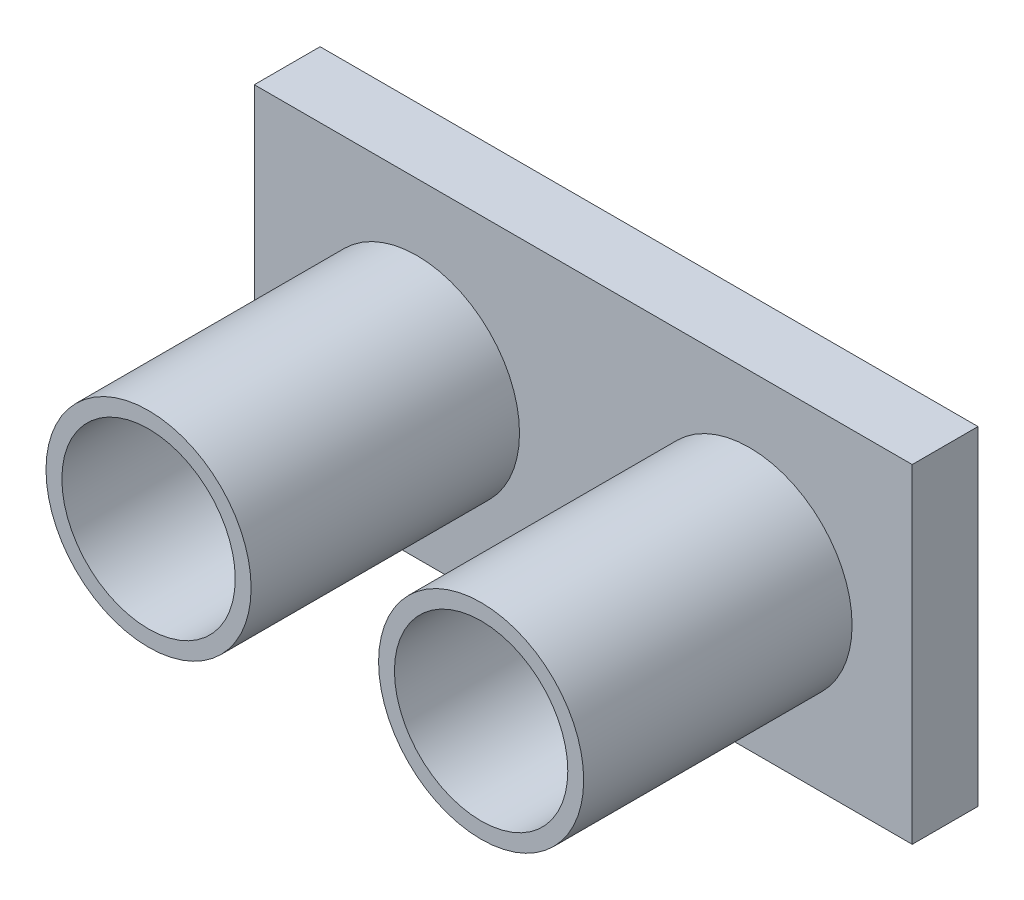
ISO-10303-21;
HEADER;
FILE_DESCRIPTION(('STEP AP214'),'2;1');
FILE_NAME('part.step','',(''),(''),'','','');
FILE_SCHEMA(('AUTOMOTIVE_DESIGN { 1 0 10303 214 1 1 1 1 }'));
ENDSEC;
DATA;
#1=APPLICATION_CONTEXT('core data for automotive mechanical design processes');
#2=APPLICATION_PROTOCOL_DEFINITION('international standard','automotive_design',2000,#1);
#3=PRODUCT_CONTEXT('',#1,'mechanical');
#4=PRODUCT('Part','Part','',(#3));
#5=PRODUCT_RELATED_PRODUCT_CATEGORY('part','',(#4));
#6=PRODUCT_DEFINITION_FORMATION('','',#4);
#7=PRODUCT_DEFINITION_CONTEXT('part definition',#1,'design');
#8=PRODUCT_DEFINITION('design','',#6,#7);
#9=PRODUCT_DEFINITION_SHAPE('','',#8);
#10=(LENGTH_UNIT() NAMED_UNIT(*) SI_UNIT(.MILLI.,.METRE.));
#11=(NAMED_UNIT(*) PLANE_ANGLE_UNIT() SI_UNIT($,.RADIAN.));
#12=(NAMED_UNIT(*) SI_UNIT($,.STERADIAN.) SOLID_ANGLE_UNIT());
#13=UNCERTAINTY_MEASURE_WITH_UNIT(LENGTH_MEASURE(1.E-05),#10,'distance_accuracy_value','');
#14=(GEOMETRIC_REPRESENTATION_CONTEXT(3) GLOBAL_UNCERTAINTY_ASSIGNED_CONTEXT((#13)) GLOBAL_UNIT_ASSIGNED_CONTEXT((#10,
#11,#12)) REPRESENTATION_CONTEXT('',''));
#15=CARTESIAN_POINT('',(0.,0.,0.));
#16=DIRECTION('',(0.,0.,1.));
#17=DIRECTION('',(1.,0.,0.));
#18=AXIS2_PLACEMENT_3D('',#15,#16,#17);
#19=CARTESIAN_POINT('',(0.,0.,10.));
#20=DIRECTION('',(-1.,0.,0.));
#21=DIRECTION('',(0.,0.,1.));
#22=AXIS2_PLACEMENT_3D('',#19,#20,#21);
#23=PLANE('',#22);
#24=DIRECTION('',(0.,1.,0.));
#25=VECTOR('',#24,1.);
#26=CARTESIAN_POINT('',(0.,0.,0.));
#27=LINE('',#26,#25);
#28=CARTESIAN_POINT('',(0.,0.,0.));
#29=VERTEX_POINT('',#28);
#30=CARTESIAN_POINT('',(0.,50.,0.));
#31=VERTEX_POINT('',#30);
#32=EDGE_CURVE('E115',#29,#31,#27,.T.);
#33=ORIENTED_EDGE('',*,*,#32,.T.);
#34=DIRECTION('',(0.,0.,-1.));
#35=VECTOR('',#34,1.);
#36=CARTESIAN_POINT('',(0.,50.,10.));
#37=LINE('',#36,#35);
#38=CARTESIAN_POINT('',(0.,50.,10.));
#39=VERTEX_POINT('',#38);
#40=EDGE_CURVE('E51',#39,#31,#37,.T.);
#41=ORIENTED_EDGE('',*,*,#40,.F.);
#42=DIRECTION('',(0.,1.,0.));
#43=VECTOR('',#42,1.);
#44=CARTESIAN_POINT('',(0.,0.,10.));
#45=LINE('',#44,#43);
#46=CARTESIAN_POINT('',(0.,0.,10.));
#47=VERTEX_POINT('',#46);
#48=EDGE_CURVE('E102',#47,#39,#45,.T.);
#49=ORIENTED_EDGE('',*,*,#48,.F.);
#50=DIRECTION('',(0.,0.,-1.));
#51=VECTOR('',#50,1.);
#52=CARTESIAN_POINT('',(0.,0.,10.));
#53=LINE('',#52,#51);
#54=EDGE_CURVE('E111',#47,#29,#53,.T.);
#55=ORIENTED_EDGE('',*,*,#54,.T.);
#56=EDGE_LOOP('',(#33,#41,#49,#55));
#57=FACE_BOUND('',#56,.T.);
#58=ADVANCED_FACE('F48',(#57),#23,.F.);
#59=CARTESIAN_POINT('',(0.,50.,10.));
#60=DIRECTION('',(0.,-1.,0.));
#61=DIRECTION('',(1.,0.,0.));
#62=AXIS2_PLACEMENT_3D('',#59,#60,#61);
#63=PLANE('',#62);
#64=DIRECTION('',(-1.,0.,0.));
#65=VECTOR('',#64,1.);
#66=CARTESIAN_POINT('',(0.,50.,0.));
#67=LINE('',#66,#65);
#68=CARTESIAN_POINT('',(-100.,50.,0.));
#69=VERTEX_POINT('',#68);
#70=EDGE_CURVE('E107',#31,#69,#67,.T.);
#71=ORIENTED_EDGE('',*,*,#70,.T.);
#72=DIRECTION('',(0.,0.,-1.));
#73=VECTOR('',#72,1.);
#74=CARTESIAN_POINT('',(-100.,50.,10.));
#75=LINE('',#74,#73);
#76=CARTESIAN_POINT('',(-100.,50.,10.));
#77=VERTEX_POINT('',#76);
#78=EDGE_CURVE('E105',#77,#69,#75,.T.);
#79=ORIENTED_EDGE('',*,*,#78,.F.);
#80=DIRECTION('',(-1.,0.,0.));
#81=VECTOR('',#80,1.);
#82=CARTESIAN_POINT('',(0.,50.,10.));
#83=LINE('',#82,#81);
#84=EDGE_CURVE('E97',#39,#77,#83,.T.);
#85=ORIENTED_EDGE('',*,*,#84,.F.);
#86=ORIENTED_EDGE('',*,*,#40,.T.);
#87=EDGE_LOOP('',(#71,#79,#85,#86));
#88=FACE_BOUND('',#87,.T.);
#89=ADVANCED_FACE('F106',(#88),#63,.F.);
#90=CARTESIAN_POINT('',(-100.,0.,10.));
#91=DIRECTION('',(1.,0.,0.));
#92=DIRECTION('',(0.,0.,-1.));
#93=AXIS2_PLACEMENT_3D('',#90,#91,#92);
#94=PLANE('',#93);
#95=DIRECTION('',(0.,-1.,0.));
#96=VECTOR('',#95,1.);
#97=CARTESIAN_POINT('',(-100.,0.,0.));
#98=LINE('',#97,#96);
#99=CARTESIAN_POINT('',(-100.,0.,0.));
#100=VERTEX_POINT('',#99);
#101=EDGE_CURVE('E83',#69,#100,#98,.T.);
#102=ORIENTED_EDGE('',*,*,#101,.T.);
#103=DIRECTION('',(0.,0.,-1.));
#104=VECTOR('',#103,1.);
#105=CARTESIAN_POINT('',(-100.,0.,10.));
#106=LINE('',#105,#104);
#107=CARTESIAN_POINT('',(-100.,0.,10.));
#108=VERTEX_POINT('',#107);
#109=EDGE_CURVE('E108',#108,#100,#106,.T.);
#110=ORIENTED_EDGE('',*,*,#109,.F.);
#111=DIRECTION('',(0.,-1.,0.));
#112=VECTOR('',#111,1.);
#113=CARTESIAN_POINT('',(-100.,0.,10.));
#114=LINE('',#113,#112);
#115=EDGE_CURVE('E100',#77,#108,#114,.T.);
#116=ORIENTED_EDGE('',*,*,#115,.F.);
#117=ORIENTED_EDGE('',*,*,#78,.T.);
#118=EDGE_LOOP('',(#102,#110,#116,#117));
#119=FACE_BOUND('',#118,.T.);
#120=ADVANCED_FACE('F109',(#119),#94,.F.);
#121=CARTESIAN_POINT('',(0.,0.,10.));
#122=DIRECTION('',(0.,1.,0.));
#123=DIRECTION('',(0.,0.,1.));
#124=AXIS2_PLACEMENT_3D('',#121,#122,#123);
#125=PLANE('',#124);
#126=DIRECTION('',(1.,0.,0.));
#127=VECTOR('',#126,1.);
#128=CARTESIAN_POINT('',(0.,0.,0.));
#129=LINE('',#128,#127);
#130=EDGE_CURVE('E89',#100,#29,#129,.T.);
#131=ORIENTED_EDGE('',*,*,#130,.T.);
#132=ORIENTED_EDGE('',*,*,#54,.F.);
#133=DIRECTION('',(1.,0.,0.));
#134=VECTOR('',#133,1.);
#135=CARTESIAN_POINT('',(0.,0.,10.));
#136=LINE('',#135,#134);
#137=EDGE_CURVE('E66',#108,#47,#136,.T.);
#138=ORIENTED_EDGE('',*,*,#137,.F.);
#139=ORIENTED_EDGE('',*,*,#109,.T.);
#140=EDGE_LOOP('',(#131,#132,#138,#139));
#141=FACE_BOUND('',#140,.T.);
#142=ADVANCED_FACE('F123',(#141),#125,.F.);
#143=CARTESIAN_POINT('',(0.,0.,10.));
#144=DIRECTION('',(0.,0.,1.));
#145=DIRECTION('',(1.,0.,0.));
#146=AXIS2_PLACEMENT_3D('',#143,#144,#145);
#147=PLANE('',#146);
#148=CARTESIAN_POINT('',(-24.7247612763741,24.2880370084113,10.));
#149=DIRECTION('',(0.,0.,1.));
#150=DIRECTION('',(1.,0.,0.));
#151=AXIS2_PLACEMENT_3D('',#148,#149,#150);
#152=CIRCLE('',#151,15.587917705514);
#153=CARTESIAN_POINT('',(-9.13684357086012,24.2880370084113,10.));
#154=VERTEX_POINT('',#153);
#155=EDGE_CURVE('E139',#154,#154,#152,.F.);
#156=ORIENTED_EDGE('',*,*,#155,.T.);
#157=EDGE_LOOP('',(#156));
#158=FACE_BOUND('',#157,.T.);
#159=CARTESIAN_POINT('',(-75.2752387236259,24.2880370084113,10.));
#160=DIRECTION('',(0.,0.,1.));
#161=DIRECTION('',(1.,0.,0.));
#162=AXIS2_PLACEMENT_3D('',#159,#160,#161);
#163=CIRCLE('',#162,15.587917705514);
#164=CARTESIAN_POINT('',(-59.6873210181119,24.2880370084113,10.));
#165=VERTEX_POINT('',#164);
#166=EDGE_CURVE('E118',#165,#165,#163,.F.);
#167=ORIENTED_EDGE('',*,*,#166,.T.);
#168=EDGE_LOOP('',(#167));
#169=FACE_BOUND('',#168,.T.);
#170=ORIENTED_EDGE('',*,*,#48,.T.);
#171=ORIENTED_EDGE('',*,*,#84,.T.);
#172=ORIENTED_EDGE('',*,*,#115,.T.);
#173=ORIENTED_EDGE('',*,*,#137,.T.);
#174=EDGE_LOOP('',(#170,#171,#172,#173));
#175=FACE_BOUND('',#174,.T.);
#176=ADVANCED_FACE('F98',(#158,#169,#175),#147,.T.);
#177=CARTESIAN_POINT('',(0.,0.,0.));
#178=DIRECTION('',(0.,0.,1.));
#179=DIRECTION('',(1.,0.,0.));
#180=AXIS2_PLACEMENT_3D('',#177,#178,#179);
#181=PLANE('',#180);
#182=ORIENTED_EDGE('',*,*,#32,.F.);
#183=ORIENTED_EDGE('',*,*,#130,.F.);
#184=ORIENTED_EDGE('',*,*,#101,.F.);
#185=ORIENTED_EDGE('',*,*,#70,.F.);
#186=EDGE_LOOP('',(#182,#183,#184,#185));
#187=FACE_BOUND('',#186,.T.);
#188=ADVANCED_FACE('F126',(#187),#181,.F.);
#189=CARTESIAN_POINT('',(-75.2752387236259,24.2880370084113,50.8));
#190=DIRECTION('',(0.,0.,1.));
#191=DIRECTION('',(1.,0.,0.));
#192=AXIS2_PLACEMENT_3D('',#189,#190,#191);
#193=PLANE('',#192);
#194=CARTESIAN_POINT('',(-75.2752387236259,24.2880370084113,50.8));
#195=DIRECTION('',(0.,0.,1.));
#196=DIRECTION('',(1.,0.,0.));
#197=AXIS2_PLACEMENT_3D('',#194,#195,#196);
#198=CIRCLE('',#197,15.587917705514);
#199=CARTESIAN_POINT('',(-59.6873210181119,24.2880370084113,50.8));
#200=VERTEX_POINT('',#199);
#201=EDGE_CURVE('E131',#200,#200,#198,.T.);
#202=ORIENTED_EDGE('',*,*,#201,.T.);
#203=EDGE_LOOP('',(#202));
#204=FACE_BOUND('',#203,.T.);
#205=CARTESIAN_POINT('',(-75.2752387236259,24.2880370084113,50.8));
#206=DIRECTION('',(0.,0.,1.));
#207=DIRECTION('',(1.,0.,0.));
#208=AXIS2_PLACEMENT_3D('',#205,#206,#207);
#209=CIRCLE('',#208,13.175239119621);
#210=CARTESIAN_POINT('',(-62.0999996040048,24.2880370084113,50.8));
#211=VERTEX_POINT('',#210);
#212=EDGE_CURVE('E136',#211,#211,#209,.T.);
#213=ORIENTED_EDGE('',*,*,#212,.F.);
#214=EDGE_LOOP('',(#213));
#215=FACE_BOUND('',#214,.T.);
#216=ADVANCED_FACE('F180',(#204,#215),#193,.T.);
#217=CARTESIAN_POINT('',(-75.2752387236259,24.2880370084113,50.8));
#218=DIRECTION('',(0.,0.,-1.));
#219=DIRECTION('',(-1.,0.,0.));
#220=AXIS2_PLACEMENT_3D('',#217,#218,#219);
#221=CYLINDRICAL_SURFACE('',#220,15.587917705514);
#222=ORIENTED_EDGE('',*,*,#166,.F.);
#223=EDGE_LOOP('',(#222));
#224=FACE_BOUND('',#223,.T.);
#225=ORIENTED_EDGE('',*,*,#201,.F.);
#226=EDGE_LOOP('',(#225));
#227=FACE_BOUND('',#226,.T.);
#228=ADVANCED_FACE('F184',(#224,#227),#221,.T.);
#229=CARTESIAN_POINT('',(-75.2752387236259,24.2880370084113,50.8));
#230=DIRECTION('',(0.,0.,-1.));
#231=DIRECTION('',(-1.,0.,0.));
#232=AXIS2_PLACEMENT_3D('',#229,#230,#231);
#233=CYLINDRICAL_SURFACE('',#232,13.175239119621);
#234=CARTESIAN_POINT('',(-75.2752387236259,24.2880370084113,10.));
#235=DIRECTION('',(0.,0.,1.));
#236=DIRECTION('',(1.,0.,0.));
#237=AXIS2_PLACEMENT_3D('',#234,#235,#236);
#238=CIRCLE('',#237,13.175239119621);
#239=CARTESIAN_POINT('',(-62.0999996040048,24.2880370084113,10.));
#240=VERTEX_POINT('',#239);
#241=EDGE_CURVE('E57',#240,#240,#238,.F.);
#242=ORIENTED_EDGE('',*,*,#241,.T.);
#243=EDGE_LOOP('',(#242));
#244=FACE_BOUND('',#243,.T.);
#245=ORIENTED_EDGE('',*,*,#212,.T.);
#246=EDGE_LOOP('',(#245));
#247=FACE_BOUND('',#246,.T.);
#248=ADVANCED_FACE('F163',(#244,#247),#233,.F.);
#249=ORIENTED_EDGE('',*,*,#241,.F.);
#250=EDGE_LOOP('',(#249));
#251=FACE_BOUND('',#250,.T.);
#252=ADVANCED_FACE('F154',(#251),#147,.T.);
#253=CARTESIAN_POINT('',(-24.7247612763741,24.2880370084113,50.8));
#254=DIRECTION('',(0.,0.,-1.));
#255=DIRECTION('',(-1.,0.,0.));
#256=AXIS2_PLACEMENT_3D('',#253,#254,#255);
#257=PLANE('',#256);
#258=CARTESIAN_POINT('',(-24.7247612763741,24.2880370084113,50.8));
#259=DIRECTION('',(0.,0.,1.));
#260=DIRECTION('',(-1.,0.,0.));
#261=AXIS2_PLACEMENT_3D('',#258,#259,#260);
#262=CIRCLE('',#261,15.587917705514);
#263=CARTESIAN_POINT('',(-40.3126789818881,24.2880370084113,50.8));
#264=VERTEX_POINT('',#263);
#265=EDGE_CURVE('E141',#264,#264,#262,.T.);
#266=ORIENTED_EDGE('',*,*,#265,.T.);
#267=EDGE_LOOP('',(#266));
#268=FACE_BOUND('',#267,.T.);
#269=CARTESIAN_POINT('',(-24.7247612763741,24.2880370084113,50.8));
#270=DIRECTION('',(0.,0.,1.));
#271=DIRECTION('',(-1.,0.,0.));
#272=AXIS2_PLACEMENT_3D('',#269,#270,#271);
#273=CIRCLE('',#272,13.175239119621);
#274=CARTESIAN_POINT('',(-37.9000003959952,24.2880370084113,50.8));
#275=VERTEX_POINT('',#274);
#276=EDGE_CURVE('E145',#275,#275,#273,.T.);
#277=ORIENTED_EDGE('',*,*,#276,.F.);
#278=EDGE_LOOP('',(#277));
#279=FACE_BOUND('',#278,.T.);
#280=ADVANCED_FACE('F151',(#268,#279),#257,.F.);
#281=CARTESIAN_POINT('',(-24.7247612763741,24.2880370084113,50.8));
#282=DIRECTION('',(0.,0.,-1.));
#283=DIRECTION('',(-1.,0.,0.));
#284=AXIS2_PLACEMENT_3D('',#281,#282,#283);
#285=CYLINDRICAL_SURFACE('',#284,15.587917705514);
#286=ORIENTED_EDGE('',*,*,#155,.F.);
#287=EDGE_LOOP('',(#286));
#288=FACE_BOUND('',#287,.T.);
#289=ORIENTED_EDGE('',*,*,#265,.F.);
#290=EDGE_LOOP('',(#289));
#291=FACE_BOUND('',#290,.T.);
#292=ADVANCED_FACE('F153',(#288,#291),#285,.T.);
#293=CARTESIAN_POINT('',(-24.7247612763741,24.2880370084113,50.8));
#294=DIRECTION('',(0.,0.,-1.));
#295=DIRECTION('',(-1.,0.,0.));
#296=AXIS2_PLACEMENT_3D('',#293,#294,#295);
#297=CYLINDRICAL_SURFACE('',#296,13.175239119621);
#298=CARTESIAN_POINT('',(-24.7247612763741,24.2880370084113,10.));
#299=DIRECTION('',(0.,0.,1.));
#300=DIRECTION('',(1.,0.,0.));
#301=AXIS2_PLACEMENT_3D('',#298,#299,#300);
#302=CIRCLE('',#301,13.175239119621);
#303=CARTESIAN_POINT('',(-11.5495221567531,24.2880370084113,10.));
#304=VERTEX_POINT('',#303);
#305=EDGE_CURVE('E13',#304,#304,#302,.F.);
#306=ORIENTED_EDGE('',*,*,#305,.T.);
#307=EDGE_LOOP('',(#306));
#308=FACE_BOUND('',#307,.T.);
#309=ORIENTED_EDGE('',*,*,#276,.T.);
#310=EDGE_LOOP('',(#309));
#311=FACE_BOUND('',#310,.T.);
#312=ADVANCED_FACE('F149',(#308,#311),#297,.F.);
#313=ORIENTED_EDGE('',*,*,#305,.F.);
#314=EDGE_LOOP('',(#313));
#315=FACE_BOUND('',#314,.T.);
#316=ADVANCED_FACE('F166',(#315),#147,.T.);
#317=CLOSED_SHELL('',(#58,#89,#120,#142,#176,#188,#216,#228,#248,#252,#280,#292,#312,#316));
#318=MANIFOLD_SOLID_BREP('B2',#317);
#319=ADVANCED_BREP_SHAPE_REPRESENTATION('',(#18,#318),#14);
#320=SHAPE_DEFINITION_REPRESENTATION(#9,#319);
ENDSEC;
END-ISO-10303-21;
